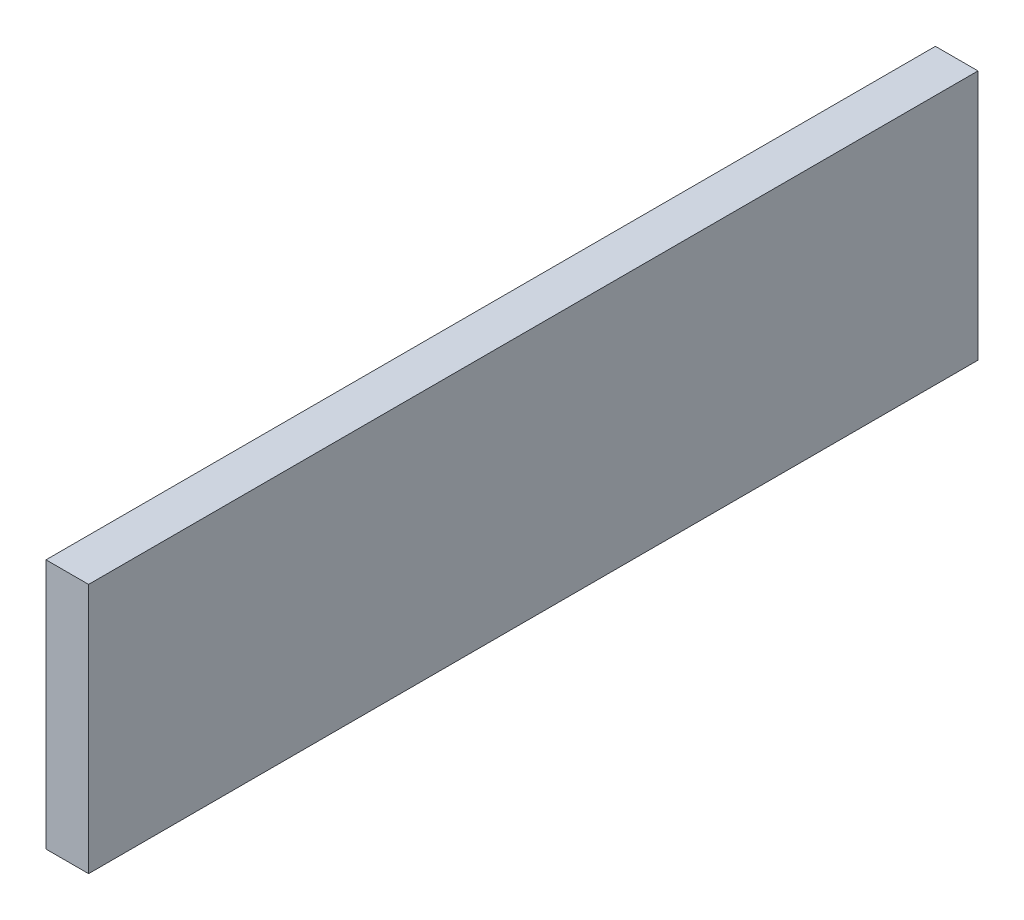
ISO-10303-21;
HEADER;
FILE_DESCRIPTION(('STEP AP214'),'2;1');
FILE_NAME('part.step','',(''),(''),'','','');
FILE_SCHEMA(('AUTOMOTIVE_DESIGN { 1 0 10303 214 1 1 1 1 }'));
ENDSEC;
DATA;
#1=APPLICATION_CONTEXT('core data for automotive mechanical design processes');
#2=APPLICATION_PROTOCOL_DEFINITION('international standard','automotive_design',2000,#1);
#3=PRODUCT_CONTEXT('',#1,'mechanical');
#4=PRODUCT('Part','Part','',(#3));
#5=PRODUCT_RELATED_PRODUCT_CATEGORY('part','',(#4));
#6=PRODUCT_DEFINITION_FORMATION('','',#4);
#7=PRODUCT_DEFINITION_CONTEXT('part definition',#1,'design');
#8=PRODUCT_DEFINITION('design','',#6,#7);
#9=PRODUCT_DEFINITION_SHAPE('','',#8);
#10=(LENGTH_UNIT() NAMED_UNIT(*) SI_UNIT(.MILLI.,.METRE.));
#11=(NAMED_UNIT(*) PLANE_ANGLE_UNIT() SI_UNIT($,.RADIAN.));
#12=(NAMED_UNIT(*) SI_UNIT($,.STERADIAN.) SOLID_ANGLE_UNIT());
#13=UNCERTAINTY_MEASURE_WITH_UNIT(LENGTH_MEASURE(1.E-05),#10,'distance_accuracy_value','');
#14=(GEOMETRIC_REPRESENTATION_CONTEXT(3) GLOBAL_UNCERTAINTY_ASSIGNED_CONTEXT((#13)) GLOBAL_UNIT_ASSIGNED_CONTEXT((#10,
#11,#12)) REPRESENTATION_CONTEXT('',''));
#15=CARTESIAN_POINT('',(0.,0.,0.));
#16=DIRECTION('',(0.,0.,1.));
#17=DIRECTION('',(1.,0.,0.));
#18=AXIS2_PLACEMENT_3D('',#15,#16,#17);
#19=CARTESIAN_POINT('',(0.,10.,0.));
#20=DIRECTION('',(1.,0.,0.));
#21=DIRECTION('',(0.,0.,-1.));
#22=AXIS2_PLACEMENT_3D('',#19,#20,#21);
#23=PLANE('',#22);
#24=DIRECTION('',(0.,0.,1.));
#25=VECTOR('',#24,1.);
#26=CARTESIAN_POINT('',(0.,0.,0.));
#27=LINE('',#26,#25);
#28=CARTESIAN_POINT('',(0.,0.,0.));
#29=VERTEX_POINT('',#28);
#30=CARTESIAN_POINT('',(0.,0.,35.5));
#31=VERTEX_POINT('',#30);
#32=EDGE_CURVE('E96',#29,#31,#27,.T.);
#33=ORIENTED_EDGE('',*,*,#32,.T.);
#34=DIRECTION('',(0.,-1.,0.));
#35=VECTOR('',#34,1.);
#36=CARTESIAN_POINT('',(0.,10.,35.5));
#37=LINE('',#36,#35);
#38=CARTESIAN_POINT('',(0.,10.,35.5));
#39=VERTEX_POINT('',#38);
#40=EDGE_CURVE('E11',#39,#31,#37,.T.);
#41=ORIENTED_EDGE('',*,*,#40,.F.);
#42=DIRECTION('',(0.,0.,1.));
#43=VECTOR('',#42,1.);
#44=CARTESIAN_POINT('',(0.,10.,0.));
#45=LINE('',#44,#43);
#46=CARTESIAN_POINT('',(0.,10.,0.));
#47=VERTEX_POINT('',#46);
#48=EDGE_CURVE('E84',#47,#39,#45,.T.);
#49=ORIENTED_EDGE('',*,*,#48,.F.);
#50=DIRECTION('',(0.,-1.,0.));
#51=VECTOR('',#50,1.);
#52=CARTESIAN_POINT('',(0.,10.,0.));
#53=LINE('',#52,#51);
#54=EDGE_CURVE('E92',#47,#29,#53,.T.);
#55=ORIENTED_EDGE('',*,*,#54,.T.);
#56=EDGE_LOOP('',(#33,#41,#49,#55));
#57=FACE_BOUND('',#56,.T.);
#58=ADVANCED_FACE('F33',(#57),#23,.F.);
#59=CARTESIAN_POINT('',(0.,10.,35.5));
#60=DIRECTION('',(0.,0.,-1.));
#61=DIRECTION('',(-1.,0.,0.));
#62=AXIS2_PLACEMENT_3D('',#59,#60,#61);
#63=PLANE('',#62);
#64=DIRECTION('',(1.,0.,0.));
#65=VECTOR('',#64,1.);
#66=CARTESIAN_POINT('',(0.,0.,35.5));
#67=LINE('',#66,#65);
#68=CARTESIAN_POINT('',(1.7,0.,35.5));
#69=VERTEX_POINT('',#68);
#70=EDGE_CURVE('E88',#31,#69,#67,.T.);
#71=ORIENTED_EDGE('',*,*,#70,.T.);
#72=DIRECTION('',(0.,-1.,0.));
#73=VECTOR('',#72,1.);
#74=CARTESIAN_POINT('',(1.7,10.,35.5));
#75=LINE('',#74,#73);
#76=CARTESIAN_POINT('',(1.7,10.,35.5));
#77=VERTEX_POINT('',#76);
#78=EDGE_CURVE('E41',#77,#69,#75,.T.);
#79=ORIENTED_EDGE('',*,*,#78,.F.);
#80=DIRECTION('',(1.,0.,0.));
#81=VECTOR('',#80,1.);
#82=CARTESIAN_POINT('',(0.,10.,35.5));
#83=LINE('',#82,#81);
#84=EDGE_CURVE('E79',#39,#77,#83,.T.);
#85=ORIENTED_EDGE('',*,*,#84,.F.);
#86=ORIENTED_EDGE('',*,*,#40,.T.);
#87=EDGE_LOOP('',(#71,#79,#85,#86));
#88=FACE_BOUND('',#87,.T.);
#89=ADVANCED_FACE('F87',(#88),#63,.F.);
#90=CARTESIAN_POINT('',(1.7,10.,0.));
#91=DIRECTION('',(-1.,0.,0.));
#92=DIRECTION('',(0.,0.,1.));
#93=AXIS2_PLACEMENT_3D('',#90,#91,#92);
#94=PLANE('',#93);
#95=DIRECTION('',(0.,0.,-1.));
#96=VECTOR('',#95,1.);
#97=CARTESIAN_POINT('',(1.7,0.,0.));
#98=LINE('',#97,#96);
#99=CARTESIAN_POINT('',(1.7,0.,0.));
#100=VERTEX_POINT('',#99);
#101=EDGE_CURVE('E66',#69,#100,#98,.T.);
#102=ORIENTED_EDGE('',*,*,#101,.T.);
#103=DIRECTION('',(0.,-1.,0.));
#104=VECTOR('',#103,1.);
#105=CARTESIAN_POINT('',(1.7,10.,0.));
#106=LINE('',#105,#104);
#107=CARTESIAN_POINT('',(1.7,10.,0.));
#108=VERTEX_POINT('',#107);
#109=EDGE_CURVE('E89',#108,#100,#106,.T.);
#110=ORIENTED_EDGE('',*,*,#109,.F.);
#111=DIRECTION('',(0.,0.,-1.));
#112=VECTOR('',#111,1.);
#113=CARTESIAN_POINT('',(1.7,10.,0.));
#114=LINE('',#113,#112);
#115=EDGE_CURVE('E82',#77,#108,#114,.T.);
#116=ORIENTED_EDGE('',*,*,#115,.F.);
#117=ORIENTED_EDGE('',*,*,#78,.T.);
#118=EDGE_LOOP('',(#102,#110,#116,#117));
#119=FACE_BOUND('',#118,.T.);
#120=ADVANCED_FACE('F90',(#119),#94,.F.);
#121=CARTESIAN_POINT('',(0.,10.,0.));
#122=DIRECTION('',(0.,0.,1.));
#123=DIRECTION('',(1.,0.,0.));
#124=AXIS2_PLACEMENT_3D('',#121,#122,#123);
#125=PLANE('',#124);
#126=DIRECTION('',(-1.,0.,0.));
#127=VECTOR('',#126,1.);
#128=CARTESIAN_POINT('',(0.,0.,0.));
#129=LINE('',#128,#127);
#130=EDGE_CURVE('E72',#100,#29,#129,.T.);
#131=ORIENTED_EDGE('',*,*,#130,.T.);
#132=ORIENTED_EDGE('',*,*,#54,.F.);
#133=DIRECTION('',(-1.,0.,0.));
#134=VECTOR('',#133,1.);
#135=CARTESIAN_POINT('',(0.,10.,0.));
#136=LINE('',#135,#134);
#137=EDGE_CURVE('E49',#108,#47,#136,.T.);
#138=ORIENTED_EDGE('',*,*,#137,.F.);
#139=ORIENTED_EDGE('',*,*,#109,.T.);
#140=EDGE_LOOP('',(#131,#132,#138,#139));
#141=FACE_BOUND('',#140,.T.);
#142=ADVANCED_FACE('F103',(#141),#125,.F.);
#143=CARTESIAN_POINT('',(0.,10.,0.));
#144=DIRECTION('',(0.,1.,0.));
#145=DIRECTION('',(0.,0.,1.));
#146=AXIS2_PLACEMENT_3D('',#143,#144,#145);
#147=PLANE('',#146);
#148=ORIENTED_EDGE('',*,*,#48,.T.);
#149=ORIENTED_EDGE('',*,*,#84,.T.);
#150=ORIENTED_EDGE('',*,*,#115,.T.);
#151=ORIENTED_EDGE('',*,*,#137,.T.);
#152=EDGE_LOOP('',(#148,#149,#150,#151));
#153=FACE_BOUND('',#152,.T.);
#154=ADVANCED_FACE('F80',(#153),#147,.T.);
#155=CARTESIAN_POINT('',(0.,0.,0.));
#156=DIRECTION('',(0.,1.,0.));
#157=DIRECTION('',(0.,0.,1.));
#158=AXIS2_PLACEMENT_3D('',#155,#156,#157);
#159=PLANE('',#158);
#160=ORIENTED_EDGE('',*,*,#32,.F.);
#161=ORIENTED_EDGE('',*,*,#130,.F.);
#162=ORIENTED_EDGE('',*,*,#101,.F.);
#163=ORIENTED_EDGE('',*,*,#70,.F.);
#164=EDGE_LOOP('',(#160,#161,#162,#163));
#165=FACE_BOUND('',#164,.T.);
#166=ADVANCED_FACE('F106',(#165),#159,.F.);
#167=CLOSED_SHELL('',(#58,#89,#120,#142,#154,#166));
#168=MANIFOLD_SOLID_BREP('B2',#167);
#169=ADVANCED_BREP_SHAPE_REPRESENTATION('',(#18,#168),#14);
#170=SHAPE_DEFINITION_REPRESENTATION(#9,#169);
ENDSEC;
END-ISO-10303-21;
